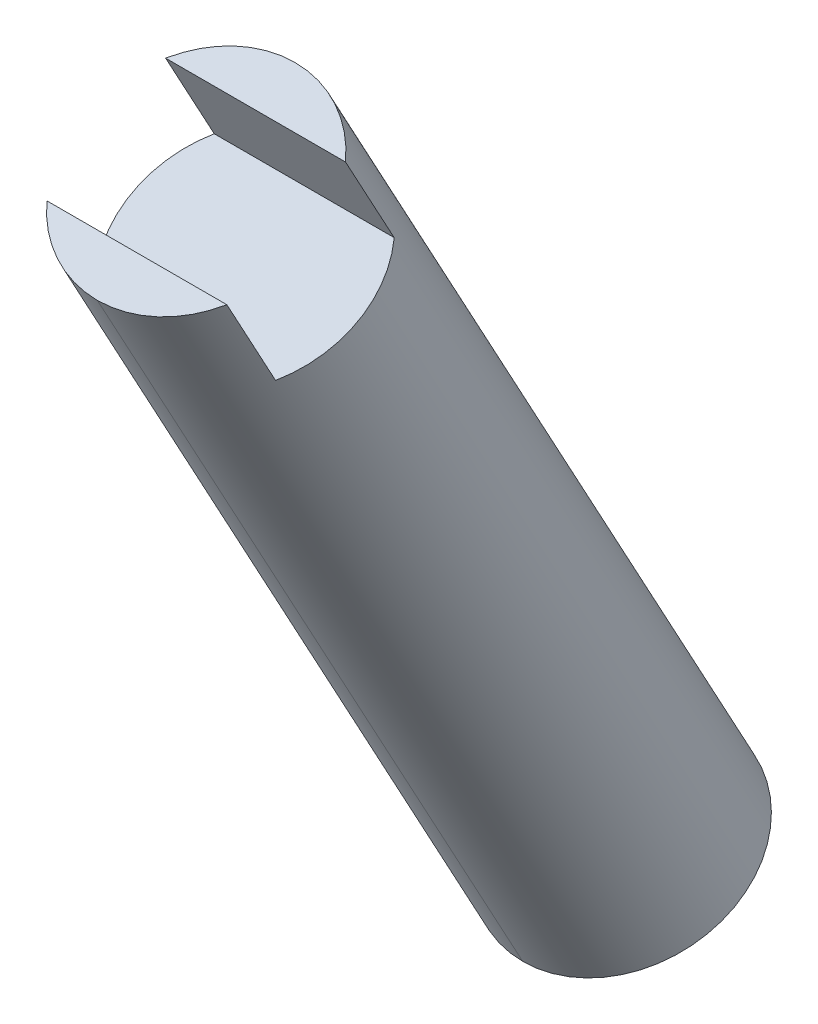
ISO-10303-21;
HEADER;
FILE_DESCRIPTION(('STEP AP214'),'2;1');
FILE_NAME('part.step','',(''),(''),'','','');
FILE_SCHEMA(('AUTOMOTIVE_DESIGN { 1 0 10303 214 1 1 1 1 }'));
ENDSEC;
DATA;
#1=APPLICATION_CONTEXT('core data for automotive mechanical design processes');
#2=APPLICATION_PROTOCOL_DEFINITION('international standard','automotive_design',2000,#1);
#3=PRODUCT_CONTEXT('',#1,'mechanical');
#4=PRODUCT('Part','Part','',(#3));
#5=PRODUCT_RELATED_PRODUCT_CATEGORY('part','',(#4));
#6=PRODUCT_DEFINITION_FORMATION('','',#4);
#7=PRODUCT_DEFINITION_CONTEXT('part definition',#1,'design');
#8=PRODUCT_DEFINITION('design','',#6,#7);
#9=PRODUCT_DEFINITION_SHAPE('','',#8);
#10=(LENGTH_UNIT() NAMED_UNIT(*) SI_UNIT(.MILLI.,.METRE.));
#11=(NAMED_UNIT(*) PLANE_ANGLE_UNIT() SI_UNIT($,.RADIAN.));
#12=(NAMED_UNIT(*) SI_UNIT($,.STERADIAN.) SOLID_ANGLE_UNIT());
#13=UNCERTAINTY_MEASURE_WITH_UNIT(LENGTH_MEASURE(1.E-05),#10,'distance_accuracy_value','');
#14=(GEOMETRIC_REPRESENTATION_CONTEXT(3) GLOBAL_UNCERTAINTY_ASSIGNED_CONTEXT((#13)) GLOBAL_UNIT_ASSIGNED_CONTEXT((#10,
#11,#12)) REPRESENTATION_CONTEXT('',''));
#15=CARTESIAN_POINT('',(0.,0.,0.));
#16=DIRECTION('',(0.,0.,1.));
#17=DIRECTION('',(1.,0.,0.));
#18=AXIS2_PLACEMENT_3D('',#15,#16,#17);
#19=CARTESIAN_POINT('',(35.525037852455,19.508207231759,2.522806678584));
#20=DIRECTION('',(-8.68675176133854E-08,0.879247274510649,0.476365647654811));
#21=DIRECTION('',(9.83749493955812E-09,-0.476365647654812,0.879247274510653));
#22=AXIS2_PLACEMENT_3D('',#19,#20,#21);
#23=CYLINDRICAL_SURFACE('',#22,1.);
#24=DIRECTION('',(-8.68675176133854E-08,0.87924727451065,0.47636564765481));
#25=VECTOR('',#24,1.);
#26=CARTESIAN_POINT('',(35.525037862292,19.031841584104,3.402053953095));
#27=LINE('',#26,#25);
#28=CARTESIAN_POINT('',(35.525037785849,19.805579185674,3.821255723031));
#29=VERTEX_POINT('',#28);
#30=CARTESIAN_POINT('',(35.52503728028,24.922798323326,6.593703792382));
#31=VERTEX_POINT('',#30);
#32=EDGE_CURVE('E156',#29,#31,#27,.T.);
#33=ORIENTED_EDGE('',*,*,#32,.T.);
#34=CARTESIAN_POINT('',(35.525037270442,25.399163970981,5.714456517871));
#35=DIRECTION('',(8.68675176133854E-08,-0.879247274510649,-0.476365647654811));
#36=DIRECTION('',(9.83749493955812E-09,-0.476365647654812,0.879247274510653));
#37=AXIS2_PLACEMENT_3D('',#34,#35,#36);
#38=CIRCLE('',#37,1.);
#39=CARTESIAN_POINT('',(35.525037260605,25.875529618635,4.83520924336));
#40=VERTEX_POINT('',#39);
#41=EDGE_CURVE('E144',#40,#31,#38,.T.);
#42=ORIENTED_EDGE('',*,*,#41,.F.);
#43=DIRECTION('',(-8.68675176133854E-08,0.87924727451065,0.47636564765481));
#44=VECTOR('',#43,1.);
#45=CARTESIAN_POINT('',(35.525037842617,19.984572879414,1.643559404074));
#46=LINE('',#45,#44);
#47=CARTESIAN_POINT('',(35.525037766174,20.758310480983,2.06276117401));
#48=VERTEX_POINT('',#47);
#49=EDGE_CURVE('E148',#48,#40,#46,.T.);
#50=ORIENTED_EDGE('',*,*,#49,.F.);
#51=CARTESIAN_POINT('',(35.525037776011,20.281944833328,2.942008448521));
#52=DIRECTION('',(8.68675176133854E-08,-0.879247274510649,-0.476365647654811));
#53=DIRECTION('',(9.83749493955812E-09,-0.476365647654812,0.879247274510653));
#54=AXIS2_PLACEMENT_3D('',#51,#52,#53);
#55=CIRCLE('',#54,1.);
#56=EDGE_CURVE('E25',#48,#29,#55,.T.);
#57=ORIENTED_EDGE('',*,*,#56,.T.);
#58=EDGE_LOOP('',(#33,#42,#50,#57));
#59=FACE_BOUND('',#58,.T.);
#60=ADVANCED_FACE('F14',(#59),#23,.F.);
#61=CARTESIAN_POINT('',(35.525037776011,20.281944833328,2.942008448521));
#62=DIRECTION('',(-8.68675176133854E-08,0.879247274510649,0.476365647654811));
#63=DIRECTION('',(9.83749493955812E-09,-0.476365647654812,0.879247274510653));
#64=AXIS2_PLACEMENT_3D('',#61,#62,#63);
#65=CYLINDRICAL_SURFACE('',#64,1.375);
#66=DIRECTION('',(-8.68675176133854E-08,0.87924727451065,0.47636564765481));
#67=VECTOR('',#66,1.);
#68=CARTESIAN_POINT('',(35.525037789538,19.626942067803,4.150973450973));
#69=LINE('',#68,#67);
#70=CARTESIAN_POINT('',(35.525037789538,19.626942067803,4.150973450973));
#71=VERTEX_POINT('',#70);
#72=CARTESIAN_POINT('',(35.525036840945,29.22832230546,9.352886323362));
#73=VERTEX_POINT('',#72);
#74=EDGE_CURVE('E140',#71,#73,#69,.T.);
#75=ORIENTED_EDGE('',*,*,#74,.T.);
#76=CARTESIAN_POINT('',(35.525036827418,29.883325070985,8.14392132091));
#77=DIRECTION('',(8.68675176133854E-08,-0.879247274510649,-0.476365647654811));
#78=DIRECTION('',(9.83749493955812E-09,-0.476365647654812,0.879247274510653));
#79=AXIS2_PLACEMENT_3D('',#76,#77,#78);
#80=CIRCLE('',#79,1.375);
#81=CARTESIAN_POINT('',(34.425036835534,29.4903233225,8.869300286377));
#82=VERTEX_POINT('',#81);
#83=EDGE_CURVE('E150',#73,#82,#80,.T.);
#84=ORIENTED_EDGE('',*,*,#83,.T.);
#85=DIRECTION('',(-8.68675176133854E-08,0.87924727451065,0.47636564765481));
#86=VECTOR('',#85,1.);
#87=CARTESIAN_POINT('',(34.425037784127,19.888943084842,3.667387413988));
#88=LINE('',#87,#86);
#89=CARTESIAN_POINT('',(34.425036944118,28.391264229361,8.273843226808));
#90=VERTEX_POINT('',#89);
#91=EDGE_CURVE('E160',#90,#82,#88,.T.);
#92=ORIENTED_EDGE('',*,*,#91,.F.);
#93=CARTESIAN_POINT('',(35.525036936002,28.784265977847,7.548464261341));
#94=DIRECTION('',(-8.68675176133854E-08,0.879247274510649,0.476365647654811));
#95=DIRECTION('',(9.83749493955812E-09,-0.476365647654812,0.879247274510653));
#96=AXIS2_PLACEMENT_3D('',#93,#94,#95);
#97=CIRCLE('',#96,1.375);
#98=CARTESIAN_POINT('',(34.425036927887,29.177267547991,6.823085223866));
#99=VERTEX_POINT('',#98);
#100=EDGE_CURVE('E100',#99,#90,#97,.T.);
#101=ORIENTED_EDGE('',*,*,#100,.F.);
#102=DIRECTION('',(8.68675176133854E-08,-0.87924727451065,-0.47636564765481));
#103=VECTOR('',#102,1.);
#104=CARTESIAN_POINT('',(34.425037767895,20.674946403473,2.216629411045));
#105=LINE('',#104,#103);
#106=CARTESIAN_POINT('',(34.425036819302,30.27632664113,7.418542283434));
#107=VERTEX_POINT('',#106);
#108=EDGE_CURVE('E122',#107,#99,#105,.T.);
#109=ORIENTED_EDGE('',*,*,#108,.F.);
#110=CARTESIAN_POINT('',(35.525036827418,29.883325070985,8.14392132091));
#111=DIRECTION('',(8.68675176133854E-08,-0.879247274510649,-0.476365647654811));
#112=DIRECTION('',(9.83749493955812E-09,-0.476365647654812,0.879247274510653));
#113=AXIS2_PLACEMENT_3D('',#110,#111,#112);
#114=CIRCLE('',#113,1.375);
#115=CARTESIAN_POINT('',(35.525036813891,30.538327836511,6.934956318457));
#116=VERTEX_POINT('',#115);
#117=EDGE_CURVE('E109',#107,#116,#114,.T.);
#118=ORIENTED_EDGE('',*,*,#117,.T.);
#119=DIRECTION('',(-8.68675176133854E-08,0.87924727451065,0.47636564765481));
#120=VECTOR('',#119,1.);
#121=CARTESIAN_POINT('',(35.525037762485,20.936947598853,1.733043446068));
#122=LINE('',#121,#120);
#123=CARTESIAN_POINT('',(35.525037762485,20.936947598853,1.733043446068));
#124=VERTEX_POINT('',#123);
#125=EDGE_CURVE('E178',#124,#116,#122,.T.);
#126=ORIENTED_EDGE('',*,*,#125,.F.);
#127=CARTESIAN_POINT('',(35.525037776011,20.281944833328,2.942008448521));
#128=DIRECTION('',(-8.68675176133854E-08,0.879247274510649,0.476365647654811));
#129=DIRECTION('',(9.83749493955812E-09,-0.476365647654812,0.879247274510653));
#130=AXIS2_PLACEMENT_3D('',#127,#128,#129);
#131=CIRCLE('',#130,1.375);
#132=EDGE_CURVE('E9',#124,#71,#131,.T.);
#133=ORIENTED_EDGE('',*,*,#132,.T.);
#134=EDGE_LOOP('',(#75,#84,#92,#101,#109,#118,#126,#133));
#135=FACE_BOUND('',#134,.T.);
#136=ADVANCED_FACE('F127',(#135),#65,.T.);
#137=CARTESIAN_POINT('',(35.525037776011,20.281944833328,2.942008448521));
#138=DIRECTION('',(8.68675176133854E-08,-0.87924727451065,-0.47636564765481));
#139=DIRECTION('',(0.,0.476365647654812,-0.879247274510653));
#140=AXIS2_PLACEMENT_3D('',#137,#138,#139);
#141=PLANE('',#140);
#142=ORIENTED_EDGE('',*,*,#132,.F.);
#143=CARTESIAN_POINT('',(35.525037776011,20.281944833328,2.942008448521));
#144=DIRECTION('',(-8.68675176133854E-08,0.879247274510649,0.476365647654811));
#145=DIRECTION('',(9.83749493955812E-09,-0.476365647654812,0.879247274510653));
#146=AXIS2_PLACEMENT_3D('',#143,#144,#145);
#147=CIRCLE('',#146,1.375);
#148=EDGE_CURVE('E143',#71,#124,#147,.T.);
#149=ORIENTED_EDGE('',*,*,#148,.F.);
#150=EDGE_LOOP('',(#142,#149));
#151=FACE_BOUND('',#150,.T.);
#152=ORIENTED_EDGE('',*,*,#56,.F.);
#153=CARTESIAN_POINT('',(35.525037776011,20.281944833328,2.942008448521));
#154=DIRECTION('',(8.68675176133854E-08,-0.879247274510649,-0.476365647654811));
#155=DIRECTION('',(9.83749493955812E-09,-0.476365647654812,0.879247274510653));
#156=AXIS2_PLACEMENT_3D('',#153,#154,#155);
#157=CIRCLE('',#156,1.);
#158=EDGE_CURVE('E18',#29,#48,#157,.T.);
#159=ORIENTED_EDGE('',*,*,#158,.F.);
#160=EDGE_LOOP('',(#152,#159));
#161=FACE_BOUND('',#160,.T.);
#162=ADVANCED_FACE('F16',(#151,#161),#141,.T.);
#163=CARTESIAN_POINT('',(35.525037776011,20.281944833328,2.942008448521));
#164=DIRECTION('',(-8.68675176133854E-08,0.879247274510649,0.476365647654811));
#165=DIRECTION('',(9.83749493955812E-09,-0.476365647654812,0.879247274510653));
#166=AXIS2_PLACEMENT_3D('',#163,#164,#165);
#167=CYLINDRICAL_SURFACE('',#166,1.375);
#168=CARTESIAN_POINT('',(35.525036827418,29.883325070985,8.14392132091));
#169=DIRECTION('',(8.68675176133854E-08,-0.879247274510649,-0.476365647654811));
#170=DIRECTION('',(9.83749493955812E-09,-0.476365647654812,0.879247274510653));
#171=AXIS2_PLACEMENT_3D('',#168,#169,#170);
#172=CIRCLE('',#171,1.375);
#173=CARTESIAN_POINT('',(36.625036819302,30.276326819471,7.418542355443));
#174=VERTEX_POINT('',#173);
#175=EDGE_CURVE('E114',#116,#174,#172,.T.);
#176=ORIENTED_EDGE('',*,*,#175,.T.);
#177=DIRECTION('',(-8.68675176133854E-08,0.87924727451065,0.47636564765481));
#178=VECTOR('',#177,1.);
#179=CARTESIAN_POINT('',(36.625037767895,20.674946581814,2.216629483053));
#180=LINE('',#179,#178);
#181=CARTESIAN_POINT('',(36.625036927887,29.177267726333,6.823085295874));
#182=VERTEX_POINT('',#181);
#183=EDGE_CURVE('E123',#182,#174,#180,.T.);
#184=ORIENTED_EDGE('',*,*,#183,.F.);
#185=CARTESIAN_POINT('',(35.525036936002,28.784265977847,7.548464261341));
#186=DIRECTION('',(-8.68675176133854E-08,0.879247274510649,0.476365647654811));
#187=DIRECTION('',(9.83749493955812E-09,-0.476365647654812,0.879247274510653));
#188=AXIS2_PLACEMENT_3D('',#185,#186,#187);
#189=CIRCLE('',#188,1.375);
#190=CARTESIAN_POINT('',(36.625036944118,28.391264407703,8.273843298817));
#191=VERTEX_POINT('',#190);
#192=EDGE_CURVE('E78',#191,#182,#189,.T.);
#193=ORIENTED_EDGE('',*,*,#192,.F.);
#194=DIRECTION('',(8.68675176133854E-08,-0.87924727451065,-0.47636564765481));
#195=VECTOR('',#194,1.);
#196=CARTESIAN_POINT('',(36.625037784127,19.888943263184,3.667387485996));
#197=LINE('',#196,#195);
#198=CARTESIAN_POINT('',(36.625036835534,29.490323500841,8.869300358385));
#199=VERTEX_POINT('',#198);
#200=EDGE_CURVE('E125',#199,#191,#197,.T.);
#201=ORIENTED_EDGE('',*,*,#200,.F.);
#202=CARTESIAN_POINT('',(35.525036827418,29.883325070985,8.14392132091));
#203=DIRECTION('',(8.68675176133854E-08,-0.879247274510649,-0.476365647654811));
#204=DIRECTION('',(9.83749493955812E-09,-0.476365647654812,0.879247274510653));
#205=AXIS2_PLACEMENT_3D('',#202,#203,#204);
#206=CIRCLE('',#205,1.375);
#207=EDGE_CURVE('E90',#199,#73,#206,.T.);
#208=ORIENTED_EDGE('',*,*,#207,.T.);
#209=ORIENTED_EDGE('',*,*,#74,.F.);
#210=ORIENTED_EDGE('',*,*,#148,.T.);
#211=ORIENTED_EDGE('',*,*,#125,.T.);
#212=EDGE_LOOP('',(#176,#184,#193,#201,#208,#209,#210,#211));
#213=FACE_BOUND('',#212,.T.);
#214=ADVANCED_FACE('F217',(#213),#167,.T.);
#215=CARTESIAN_POINT('',(35.525037270442,25.399163970981,5.714456517871));
#216=DIRECTION('',(8.68675176133854E-08,-0.87924727451065,-0.47636564765481));
#217=DIRECTION('',(0.,0.476365647654812,-0.879247274510653));
#218=AXIS2_PLACEMENT_3D('',#215,#216,#217);
#219=PLANE('',#218);
#220=ORIENTED_EDGE('',*,*,#41,.T.);
#221=CARTESIAN_POINT('',(35.525037270442,25.399163970981,5.714456517871));
#222=DIRECTION('',(8.68675176133854E-08,-0.879247274510649,-0.476365647654811));
#223=DIRECTION('',(9.83749493955812E-09,-0.476365647654812,0.879247274510653));
#224=AXIS2_PLACEMENT_3D('',#221,#222,#223);
#225=CIRCLE('',#224,1.);
#226=EDGE_CURVE('E116',#31,#40,#225,.T.);
#227=ORIENTED_EDGE('',*,*,#226,.T.);
#228=EDGE_LOOP('',(#220,#227));
#229=FACE_BOUND('',#228,.T.);
#230=ADVANCED_FACE('F215',(#229),#219,.T.);
#231=CARTESIAN_POINT('',(35.525037852455,19.508207231759,2.522806678584));
#232=DIRECTION('',(-8.68675176133854E-08,0.879247274510649,0.476365647654811));
#233=DIRECTION('',(9.83749493955812E-09,-0.476365647654812,0.879247274510653));
#234=AXIS2_PLACEMENT_3D('',#231,#232,#233);
#235=CYLINDRICAL_SURFACE('',#234,1.);
#236=ORIENTED_EDGE('',*,*,#226,.F.);
#237=ORIENTED_EDGE('',*,*,#32,.F.);
#238=ORIENTED_EDGE('',*,*,#158,.T.);
#239=ORIENTED_EDGE('',*,*,#49,.T.);
#240=EDGE_LOOP('',(#236,#237,#238,#239));
#241=FACE_BOUND('',#240,.T.);
#242=ADVANCED_FACE('F204',(#241),#235,.F.);
#243=CARTESIAN_POINT('',(35.525036827418,29.883325070985,8.14392132091));
#244=DIRECTION('',(8.68675176133854E-08,-0.87924727451065,-0.47636564765481));
#245=DIRECTION('',(0.,0.476365647654812,-0.879247274510653));
#246=AXIS2_PLACEMENT_3D('',#243,#244,#245);
#247=PLANE('',#246);
#248=ORIENTED_EDGE('',*,*,#175,.F.);
#249=ORIENTED_EDGE('',*,*,#117,.F.);
#250=DIRECTION('',(-1.,-8.10642727532997E-08,-3.27311106744499E-08));
#251=VECTOR('',#250,1.);
#252=CARTESIAN_POINT('',(36.075036819302,30.276326774886,7.41854233744));
#253=LINE('',#252,#251);
#254=EDGE_CURVE('E112',#174,#107,#253,.T.);
#255=ORIENTED_EDGE('',*,*,#254,.F.);
#256=EDGE_LOOP('',(#248,#249,#255));
#257=FACE_BOUND('',#256,.T.);
#258=ADVANCED_FACE('F111',(#257),#247,.F.);
#259=CARTESIAN_POINT('',(35.525036827418,29.883325070985,8.14392132091));
#260=DIRECTION('',(8.68675176133854E-08,-0.87924727451065,-0.47636564765481));
#261=DIRECTION('',(0.,0.476365647654812,-0.879247274510653));
#262=AXIS2_PLACEMENT_3D('',#259,#260,#261);
#263=PLANE('',#262);
#264=ORIENTED_EDGE('',*,*,#83,.F.);
#265=ORIENTED_EDGE('',*,*,#207,.F.);
#266=DIRECTION('',(1.,8.10642727532997E-08,3.27311106744499E-08));
#267=VECTOR('',#266,1.);
#268=CARTESIAN_POINT('',(34.975036835534,29.490323367085,8.869300304379));
#269=LINE('',#268,#267);
#270=EDGE_CURVE('E139',#82,#199,#269,.T.);
#271=ORIENTED_EDGE('',*,*,#270,.F.);
#272=EDGE_LOOP('',(#264,#265,#271));
#273=FACE_BOUND('',#272,.T.);
#274=ADVANCED_FACE('F253',(#273),#263,.F.);
#275=CARTESIAN_POINT('',(35.525036936002,28.784265977847,7.548464261341));
#276=DIRECTION('',(-8.68675176133854E-08,0.87924727451065,0.47636564765481));
#277=DIRECTION('',(0.999999999999983,0.,1.82354705972272E-07));
#278=AXIS2_PLACEMENT_3D('',#275,#276,#277);
#279=PLANE('',#278);
#280=DIRECTION('',(1.,8.10642727532997E-08,3.27311106744499E-08));
#281=VECTOR('',#280,1.);
#282=CARTESIAN_POINT('',(36.900036944118,28.391264429995,8.273843307818));
#283=LINE('',#282,#281);
#284=EDGE_CURVE('E163',#90,#191,#283,.T.);
#285=ORIENTED_EDGE('',*,*,#284,.T.);
#286=ORIENTED_EDGE('',*,*,#192,.T.);
#287=DIRECTION('',(-1.,-8.10642727532997E-08,-3.27311106744499E-08));
#288=VECTOR('',#287,1.);
#289=CARTESIAN_POINT('',(34.150036927886,29.177267525699,6.823085214865));
#290=LINE('',#289,#288);
#291=EDGE_CURVE('E129',#182,#99,#290,.T.);
#292=ORIENTED_EDGE('',*,*,#291,.T.);
#293=ORIENTED_EDGE('',*,*,#100,.T.);
#294=EDGE_LOOP('',(#285,#286,#292,#293));
#295=FACE_BOUND('',#294,.T.);
#296=ADVANCED_FACE('F168',(#295),#279,.T.);
#297=CARTESIAN_POINT('',(34.425036835534,29.4903233225,8.869300286377));
#298=DIRECTION('',(9.83749493955812E-09,-0.476365647654812,0.879247274510653));
#299=DIRECTION('',(-1.,-2.06511426421887E-08,0.));
#300=AXIS2_PLACEMENT_3D('',#297,#298,#299);
#301=PLANE('',#300);
#302=ORIENTED_EDGE('',*,*,#200,.T.);
#303=ORIENTED_EDGE('',*,*,#284,.F.);
#304=ORIENTED_EDGE('',*,*,#91,.T.);
#305=ORIENTED_EDGE('',*,*,#270,.T.);
#306=EDGE_LOOP('',(#302,#303,#304,#305));
#307=FACE_BOUND('',#306,.T.);
#308=ADVANCED_FACE('F172',(#307),#301,.F.);
#309=CARTESIAN_POINT('',(36.625036819302,30.276326819471,7.418542355443));
#310=DIRECTION('',(-9.83749493955812E-09,0.476365647654812,-0.879247274510653));
#311=DIRECTION('',(-1.,0.,1.11885418638724E-08));
#312=AXIS2_PLACEMENT_3D('',#309,#310,#311);
#313=PLANE('',#312);
#314=ORIENTED_EDGE('',*,*,#108,.T.);
#315=ORIENTED_EDGE('',*,*,#291,.F.);
#316=ORIENTED_EDGE('',*,*,#183,.T.);
#317=ORIENTED_EDGE('',*,*,#254,.T.);
#318=EDGE_LOOP('',(#314,#315,#316,#317));
#319=FACE_BOUND('',#318,.T.);
#320=ADVANCED_FACE('F120',(#319),#313,.F.);
#321=CLOSED_SHELL('',(#60,#136,#162,#214,#230,#242,#258,#274,#296,#308,#320));
#322=MANIFOLD_SOLID_BREP('B1',#321);
#323=ADVANCED_BREP_SHAPE_REPRESENTATION('',(#18,#322),#14);
#324=SHAPE_DEFINITION_REPRESENTATION(#9,#323);
ENDSEC;
END-ISO-10303-21;
